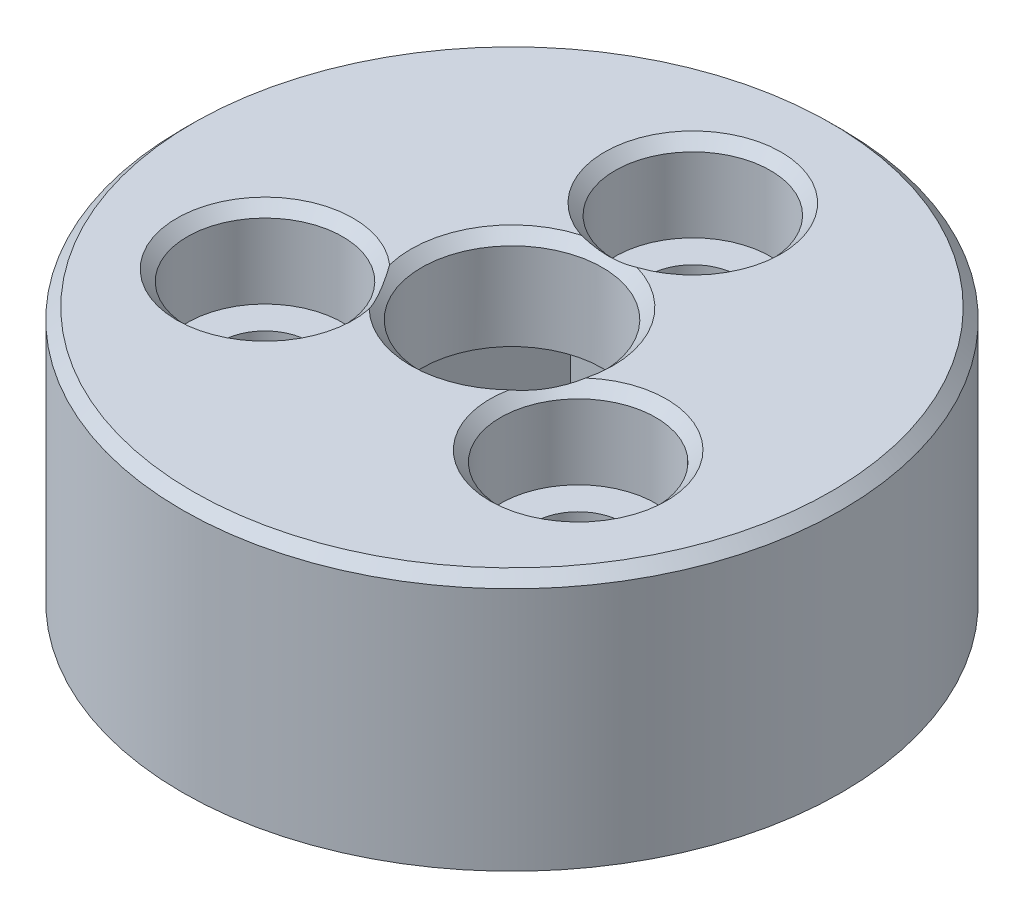
ISO-10303-21;
HEADER;
FILE_DESCRIPTION(('STEP AP214'),'2;1');
FILE_NAME('part.step','',(''),(''),'','','');
FILE_SCHEMA(('AUTOMOTIVE_DESIGN { 1 0 10303 214 1 1 1 1 }'));
ENDSEC;
DATA;
#1=APPLICATION_CONTEXT('core data for automotive mechanical design processes');
#2=APPLICATION_PROTOCOL_DEFINITION('international standard','automotive_design',2000,#1);
#3=PRODUCT_CONTEXT('',#1,'mechanical');
#4=PRODUCT('Part','Part','',(#3));
#5=PRODUCT_RELATED_PRODUCT_CATEGORY('part','',(#4));
#6=PRODUCT_DEFINITION_FORMATION('','',#4);
#7=PRODUCT_DEFINITION_CONTEXT('part definition',#1,'design');
#8=PRODUCT_DEFINITION('design','',#6,#7);
#9=PRODUCT_DEFINITION_SHAPE('','',#8);
#10=(LENGTH_UNIT() NAMED_UNIT(*) SI_UNIT(.MILLI.,.METRE.));
#11=(NAMED_UNIT(*) PLANE_ANGLE_UNIT() SI_UNIT($,.RADIAN.));
#12=(NAMED_UNIT(*) SI_UNIT($,.STERADIAN.) SOLID_ANGLE_UNIT());
#13=UNCERTAINTY_MEASURE_WITH_UNIT(LENGTH_MEASURE(1.E-05),#10,'distance_accuracy_value','');
#14=(GEOMETRIC_REPRESENTATION_CONTEXT(3) GLOBAL_UNCERTAINTY_ASSIGNED_CONTEXT((#13)) GLOBAL_UNIT_ASSIGNED_CONTEXT((#10,
#11,#12)) REPRESENTATION_CONTEXT('',''));
#15=CARTESIAN_POINT('',(0.,0.,0.));
#16=DIRECTION('',(0.,0.,1.));
#17=DIRECTION('',(1.,0.,0.));
#18=AXIS2_PLACEMENT_3D('',#15,#16,#17);
#19=CARTESIAN_POINT('',(-7.36121593216715,0.,4.25000000000033));
#20=DIRECTION('',(0.,1.,0.));
#21=DIRECTION('',(0.,0.,1.));
#22=AXIS2_PLACEMENT_3D('',#19,#20,#21);
#23=CYLINDRICAL_SURFACE('',#22,2.1);
#24=CARTESIAN_POINT('',(-7.36121593216715,7.4,4.25000000000033));
#25=DIRECTION('',(0.,-1.,0.));
#26=DIRECTION('',(0.,0.,-1.));
#27=AXIS2_PLACEMENT_3D('',#24,#25,#26);
#28=CIRCLE('',#27,2.1);
#29=CARTESIAN_POINT('',(-5.43622822501933,7.4,5.08929871162199));
#30=VERTEX_POINT('',#29);
#31=CARTESIAN_POINT('',(-7.11454987921227,7.4,2.16453701583599));
#32=VERTEX_POINT('',#31);
#33=EDGE_CURVE('E257',#30,#32,#28,.F.);
#34=ORIENTED_EDGE('',*,*,#33,.F.);
#35=DIRECTION('',(0.,1.,0.));
#36=VECTOR('',#35,1.);
#37=CARTESIAN_POINT('',(-5.43622822501933,0.,5.08929871162199));
#38=LINE('',#37,#36);
#39=CARTESIAN_POINT('',(-5.43622822501933,0.,5.08929871162199));
#40=VERTEX_POINT('',#39);
#41=EDGE_CURVE('E395',#30,#40,#38,.F.);
#42=ORIENTED_EDGE('',*,*,#41,.T.);
#43=CARTESIAN_POINT('',(-7.36121593216715,0.,4.25000000000033));
#44=DIRECTION('',(0.,1.,0.));
#45=DIRECTION('',(0.,0.,1.));
#46=AXIS2_PLACEMENT_3D('',#43,#44,#45);
#47=CIRCLE('',#46,2.1);
#48=CARTESIAN_POINT('',(-7.11454987921227,0.,2.16453701583599));
#49=VERTEX_POINT('',#48);
#50=EDGE_CURVE('E261',#49,#40,#47,.T.);
#51=ORIENTED_EDGE('',*,*,#50,.F.);
#52=DIRECTION('',(0.,1.,0.));
#53=VECTOR('',#52,1.);
#54=CARTESIAN_POINT('',(-7.11454987921227,0.,2.16453701583599));
#55=LINE('',#54,#53);
#56=EDGE_CURVE('E392',#49,#32,#55,.T.);
#57=ORIENTED_EDGE('',*,*,#56,.T.);
#58=EDGE_LOOP('',(#34,#42,#51,#57));
#59=FACE_BOUND('',#58,.T.);
#60=CARTESIAN_POINT('',(-7.36121593216715,8.,4.25000000000033));
#61=DIRECTION('',(0.,1.,0.));
#62=DIRECTION('',(0.,0.,1.));
#63=AXIS2_PLACEMENT_3D('',#60,#61,#62);
#64=CIRCLE('',#63,2.1);
#65=CARTESIAN_POINT('',(-7.36121593216715,8.,6.35000000000033));
#66=VERTEX_POINT('',#65);
#67=EDGE_CURVE('E283',#66,#66,#64,.F.);
#68=ORIENTED_EDGE('',*,*,#67,.F.);
#69=EDGE_LOOP('',(#68));
#70=FACE_BOUND('',#69,.T.);
#71=ADVANCED_FACE('F36',(#59,#70),#23,.F.);
#72=CARTESIAN_POINT('',(7.3612159321683,0.,4.24999999999967));
#73=DIRECTION('',(0.,1.,0.));
#74=DIRECTION('',(0.,0.,1.));
#75=AXIS2_PLACEMENT_3D('',#72,#73,#74);
#76=CYLINDRICAL_SURFACE('',#75,2.1);
#77=CARTESIAN_POINT('',(7.3612159321683,7.4,4.24999999999967));
#78=DIRECTION('',(0.,-1.,0.));
#79=DIRECTION('',(0.,0.,-1.));
#80=AXIS2_PLACEMENT_3D('',#77,#78,#79);
#81=CIRCLE('',#80,2.1);
#82=CARTESIAN_POINT('',(7.12557608422164,7.4,2.16326238782614));
#83=VERTEX_POINT('',#82);
#84=CARTESIAN_POINT('',(5.43181898275217,7.4,5.07911242397106));
#85=VERTEX_POINT('',#84);
#86=EDGE_CURVE('E255',#83,#85,#81,.F.);
#87=ORIENTED_EDGE('',*,*,#86,.F.);
#88=DIRECTION('',(0.,1.,0.));
#89=VECTOR('',#88,1.);
#90=CARTESIAN_POINT('',(7.12557608422164,0.,2.16326238782614));
#91=LINE('',#90,#89);
#92=CARTESIAN_POINT('',(7.12557608422164,0.,2.16326238782614));
#93=VERTEX_POINT('',#92);
#94=EDGE_CURVE('E373',#83,#93,#91,.F.);
#95=ORIENTED_EDGE('',*,*,#94,.T.);
#96=CARTESIAN_POINT('',(7.3612159321683,0.,4.24999999999967));
#97=DIRECTION('',(0.,1.,0.));
#98=DIRECTION('',(0.,0.,1.));
#99=AXIS2_PLACEMENT_3D('',#96,#97,#98);
#100=CIRCLE('',#99,2.1);
#101=CARTESIAN_POINT('',(5.43181898275217,0.,5.07911242397106));
#102=VERTEX_POINT('',#101);
#103=EDGE_CURVE('E262',#102,#93,#100,.T.);
#104=ORIENTED_EDGE('',*,*,#103,.F.);
#105=DIRECTION('',(0.,1.,0.));
#106=VECTOR('',#105,1.);
#107=CARTESIAN_POINT('',(5.43181898275217,0.,5.07911242397106));
#108=LINE('',#107,#106);
#109=EDGE_CURVE('E323',#102,#85,#108,.T.);
#110=ORIENTED_EDGE('',*,*,#109,.T.);
#111=EDGE_LOOP('',(#87,#95,#104,#110));
#112=FACE_BOUND('',#111,.T.);
#113=CARTESIAN_POINT('',(7.3612159321683,8.,4.24999999999967));
#114=DIRECTION('',(0.,1.,0.));
#115=DIRECTION('',(0.,0.,1.));
#116=AXIS2_PLACEMENT_3D('',#113,#114,#115);
#117=CIRCLE('',#116,2.1);
#118=CARTESIAN_POINT('',(7.3612159321683,8.,6.34999999999967));
#119=VERTEX_POINT('',#118);
#120=EDGE_CURVE('E280',#119,#119,#117,.F.);
#121=ORIENTED_EDGE('',*,*,#120,.F.);
#122=EDGE_LOOP('',(#121));
#123=FACE_BOUND('',#122,.T.);
#124=ADVANCED_FACE('F463',(#112,#123),#76,.F.);
#125=CARTESIAN_POINT('',(0.,0.,-8.5));
#126=DIRECTION('',(0.,1.,0.));
#127=DIRECTION('',(0.,0.,1.));
#128=AXIS2_PLACEMENT_3D('',#125,#126,#127);
#129=CYLINDRICAL_SURFACE('',#128,2.1);
#130=CARTESIAN_POINT('',(0.,0.,-8.5));
#131=DIRECTION('',(0.,1.,0.));
#132=DIRECTION('',(0.,0.,1.));
#133=AXIS2_PLACEMENT_3D('',#130,#131,#132);
#134=CIRCLE('',#133,2.1);
#135=CARTESIAN_POINT('',(1.68273089646079,0.,-7.24364943980739));
#136=VERTEX_POINT('',#135);
#137=CARTESIAN_POINT('',(-1.68934785920162,0.,-7.25256109944779));
#138=VERTEX_POINT('',#137);
#139=EDGE_CURVE('E265',#136,#138,#134,.T.);
#140=ORIENTED_EDGE('',*,*,#139,.F.);
#141=DIRECTION('',(0.,1.,0.));
#142=VECTOR('',#141,1.);
#143=CARTESIAN_POINT('',(1.68273089646079,0.,-7.24364943980739));
#144=LINE('',#143,#142);
#145=CARTESIAN_POINT('',(1.68273089646079,7.4,-7.24364943980739));
#146=VERTEX_POINT('',#145);
#147=EDGE_CURVE('E405',#136,#146,#144,.T.);
#148=ORIENTED_EDGE('',*,*,#147,.T.);
#149=CARTESIAN_POINT('',(0.,7.4,-8.5));
#150=DIRECTION('',(0.,-1.,0.));
#151=DIRECTION('',(0.,0.,-1.));
#152=AXIS2_PLACEMENT_3D('',#149,#150,#151);
#153=CIRCLE('',#152,2.1);
#154=CARTESIAN_POINT('',(-1.68934785920162,7.4,-7.25256109944779));
#155=VERTEX_POINT('',#154);
#156=EDGE_CURVE('E259',#155,#146,#153,.F.);
#157=ORIENTED_EDGE('',*,*,#156,.F.);
#158=DIRECTION('',(0.,1.,0.));
#159=VECTOR('',#158,1.);
#160=CARTESIAN_POINT('',(-1.68934785920162,0.,-7.25256109944779));
#161=LINE('',#160,#159);
#162=EDGE_CURVE('E402',#155,#138,#161,.F.);
#163=ORIENTED_EDGE('',*,*,#162,.T.);
#164=EDGE_LOOP('',(#140,#148,#157,#163));
#165=FACE_BOUND('',#164,.T.);
#166=CARTESIAN_POINT('',(0.,8.,-8.5));
#167=DIRECTION('',(0.,1.,0.));
#168=DIRECTION('',(0.,0.,1.));
#169=AXIS2_PLACEMENT_3D('',#166,#167,#168);
#170=CIRCLE('',#169,2.1);
#171=CARTESIAN_POINT('',(0.,8.,-6.4));
#172=VERTEX_POINT('',#171);
#173=EDGE_CURVE('E276',#172,#172,#170,.F.);
#174=ORIENTED_EDGE('',*,*,#173,.F.);
#175=EDGE_LOOP('',(#174));
#176=FACE_BOUND('',#175,.T.);
#177=ADVANCED_FACE('F491',(#165,#176),#129,.F.);
#178=CARTESIAN_POINT('',(0.,0.,0.));
#179=DIRECTION('',(0.,1.,0.));
#180=DIRECTION('',(0.,0.,1.));
#181=AXIS2_PLACEMENT_3D('',#178,#179,#180);
#182=CYLINDRICAL_SURFACE('',#181,4.25);
#183=CARTESIAN_POINT('',(0.,11.5,0.));
#184=DIRECTION('',(0.,1.,0.));
#185=DIRECTION('',(0.,0.,1.));
#186=AXIS2_PLACEMENT_3D('',#183,#184,#185);
#187=CIRCLE('',#186,4.25);
#188=CARTESIAN_POINT('',(0.,11.5,4.25));
#189=VERTEX_POINT('',#188);
#190=EDGE_CURVE('E314',#189,#189,#187,.T.);
#191=ORIENTED_EDGE('',*,*,#190,.T.);
#192=EDGE_LOOP('',(#191));
#193=FACE_BOUND('',#192,.T.);
#194=CARTESIAN_POINT('',(0.,7.4,0.));
#195=DIRECTION('',(0.,-1.,0.));
#196=DIRECTION('',(0.,0.,-1.));
#197=AXIS2_PLACEMENT_3D('',#194,#195,#196);
#198=CIRCLE('',#197,4.25);
#199=CARTESIAN_POINT('',(0.,7.4,-4.25));
#200=VERTEX_POINT('',#199);
#201=EDGE_CURVE('E245',#200,#200,#198,.F.);
#202=ORIENTED_EDGE('',*,*,#201,.F.);
#203=EDGE_LOOP('',(#202));
#204=FACE_BOUND('',#203,.T.);
#205=ADVANCED_FACE('F497',(#193,#204),#182,.F.);
#206=CARTESIAN_POINT('',(0.,12.,0.));
#207=DIRECTION('',(0.,-1.,0.));
#208=DIRECTION('',(0.,0.,-1.));
#209=AXIS2_PLACEMENT_3D('',#206,#207,#208);
#210=CYLINDRICAL_SURFACE('',#209,15.5);
#211=CARTESIAN_POINT('',(0.,11.5,0.));
#212=DIRECTION('',(0.,1.,0.));
#213=DIRECTION('',(0.,0.,1.));
#214=AXIS2_PLACEMENT_3D('',#211,#212,#213);
#215=CIRCLE('',#214,15.5);
#216=CARTESIAN_POINT('',(0.,11.5,15.5));
#217=VERTEX_POINT('',#216);
#218=EDGE_CURVE('E320',#217,#217,#215,.F.);
#219=ORIENTED_EDGE('',*,*,#218,.T.);
#220=EDGE_LOOP('',(#219));
#221=FACE_BOUND('',#220,.T.);
#222=CARTESIAN_POINT('',(0.,0.,0.));
#223=DIRECTION('',(0.,1.,0.));
#224=DIRECTION('',(0.,0.,1.));
#225=AXIS2_PLACEMENT_3D('',#222,#223,#224);
#226=CIRCLE('',#225,15.5);
#227=CARTESIAN_POINT('',(0.,0.,15.5));
#228=VERTEX_POINT('',#227);
#229=EDGE_CURVE('E270',#228,#228,#226,.T.);
#230=ORIENTED_EDGE('',*,*,#229,.T.);
#231=EDGE_LOOP('',(#230));
#232=FACE_BOUND('',#231,.T.);
#233=ADVANCED_FACE('F502',(#221,#232),#210,.T.);
#234=CARTESIAN_POINT('',(0.,12.,0.));
#235=DIRECTION('',(0.,1.,0.));
#236=DIRECTION('',(0.,0.,1.));
#237=AXIS2_PLACEMENT_3D('',#234,#235,#236);
#238=PLANE('',#237);
#239=CARTESIAN_POINT('',(7.3612159321683,12.,4.24999999999967));
#240=DIRECTION('',(0.,1.,0.));
#241=DIRECTION('',(0.,0.,1.));
#242=AXIS2_PLACEMENT_3D('',#239,#240,#241);
#243=CIRCLE('',#242,4.15000000000001);
#244=CARTESIAN_POINT('',(4.61054191633622,12.,1.14254244459746));
#245=VERTEX_POINT('',#244);
#246=CARTESIAN_POINT('',(7.3612159321683,12.,8.39999999999968));
#247=VERTEX_POINT('',#246);
#248=EDGE_CURVE('E298',#245,#247,#243,.F.);
#249=ORIENTED_EDGE('',*,*,#248,.T.);
#250=CARTESIAN_POINT('',(7.3612159321683,12.,4.24999999999967));
#251=DIRECTION('',(0.,1.,0.));
#252=DIRECTION('',(0.,0.,1.));
#253=AXIS2_PLACEMENT_3D('',#250,#251,#252);
#254=CIRCLE('',#253,4.15000000000001);
#255=CARTESIAN_POINT('',(3.29474174009195,12.,3.42157520246098));
#256=VERTEX_POINT('',#255);
#257=EDGE_CURVE('E309',#247,#256,#254,.F.);
#258=ORIENTED_EDGE('',*,*,#257,.T.);
#259=CARTESIAN_POINT('',(0.,12.,0.));
#260=DIRECTION('',(0.,1.,0.));
#261=DIRECTION('',(0.,0.,1.));
#262=AXIS2_PLACEMENT_3D('',#259,#260,#261);
#263=CIRCLE('',#262,4.75);
#264=CARTESIAN_POINT('',(0.,12.,4.75));
#265=VERTEX_POINT('',#264);
#266=EDGE_CURVE('E307',#256,#265,#263,.F.);
#267=ORIENTED_EDGE('',*,*,#266,.T.);
#268=CARTESIAN_POINT('',(0.,12.,0.));
#269=DIRECTION('',(0.,1.,0.));
#270=DIRECTION('',(0.,0.,1.));
#271=AXIS2_PLACEMENT_3D('',#268,#269,#270);
#272=CIRCLE('',#271,4.75);
#273=CARTESIAN_POINT('',(-3.29474174009069,12.,3.4215752024622));
#274=VERTEX_POINT('',#273);
#275=EDGE_CURVE('E305',#265,#274,#272,.F.);
#276=ORIENTED_EDGE('',*,*,#275,.T.);
#277=CARTESIAN_POINT('',(-7.36121593216715,12.,4.25000000000033));
#278=DIRECTION('',(0.,1.,0.));
#279=DIRECTION('',(0.,0.,1.));
#280=AXIS2_PLACEMENT_3D('',#277,#278,#279);
#281=CIRCLE('',#280,4.15000000000001);
#282=CARTESIAN_POINT('',(-7.36121593216715,12.,8.40000000000034));
#283=VERTEX_POINT('',#282);
#284=EDGE_CURVE('E302',#274,#283,#281,.F.);
#285=ORIENTED_EDGE('',*,*,#284,.T.);
#286=CARTESIAN_POINT('',(-7.36121593216715,12.,4.25000000000033));
#287=DIRECTION('',(0.,1.,0.));
#288=DIRECTION('',(0.,0.,1.));
#289=AXIS2_PLACEMENT_3D('',#286,#287,#288);
#290=CIRCLE('',#289,4.15000000000001);
#291=CARTESIAN_POINT('',(-4.61054191633633,12.,1.14254244459701));
#292=VERTEX_POINT('',#291);
#293=EDGE_CURVE('E300',#283,#292,#290,.F.);
#294=ORIENTED_EDGE('',*,*,#293,.T.);
#295=CARTESIAN_POINT('',(0.,12.,0.));
#296=DIRECTION('',(0.,1.,0.));
#297=DIRECTION('',(0.,0.,1.));
#298=AXIS2_PLACEMENT_3D('',#295,#296,#297);
#299=CIRCLE('',#298,4.75);
#300=CARTESIAN_POINT('',(-1.31580017624496,12.,-4.56411764705882));
#301=VERTEX_POINT('',#300);
#302=EDGE_CURVE('E294',#292,#301,#299,.F.);
#303=ORIENTED_EDGE('',*,*,#302,.T.);
#304=CARTESIAN_POINT('',(0.,12.,-8.5));
#305=DIRECTION('',(0.,1.,0.));
#306=DIRECTION('',(0.,0.,1.));
#307=AXIS2_PLACEMENT_3D('',#304,#305,#306);
#308=CIRCLE('',#307,4.15000000000001);
#309=CARTESIAN_POINT('',(1.31580017624496,12.,-4.56411764705882));
#310=VERTEX_POINT('',#309);
#311=EDGE_CURVE('E292',#301,#310,#308,.F.);
#312=ORIENTED_EDGE('',*,*,#311,.T.);
#313=CARTESIAN_POINT('',(0.,12.,0.));
#314=DIRECTION('',(0.,1.,0.));
#315=DIRECTION('',(0.,0.,1.));
#316=AXIS2_PLACEMENT_3D('',#313,#314,#315);
#317=CIRCLE('',#316,4.75);
#318=EDGE_CURVE('E296',#310,#245,#317,.F.);
#319=ORIENTED_EDGE('',*,*,#318,.T.);
#320=EDGE_LOOP('',(#249,#258,#267,#276,#285,#294,#303,#312,#319));
#321=FACE_BOUND('',#320,.T.);
#322=CARTESIAN_POINT('',(0.,12.,0.));
#323=DIRECTION('',(0.,1.,0.));
#324=DIRECTION('',(0.,0.,1.));
#325=AXIS2_PLACEMENT_3D('',#322,#323,#324);
#326=CIRCLE('',#325,15.);
#327=CARTESIAN_POINT('',(0.,12.,15.));
#328=VERTEX_POINT('',#327);
#329=EDGE_CURVE('E289',#328,#328,#326,.T.);
#330=ORIENTED_EDGE('',*,*,#329,.T.);
#331=EDGE_LOOP('',(#330));
#332=FACE_BOUND('',#331,.T.);
#333=ADVANCED_FACE('F499',(#321,#332),#238,.T.);
#334=CARTESIAN_POINT('',(0.,0.,0.));
#335=DIRECTION('',(0.,1.,0.));
#336=DIRECTION('',(0.,0.,1.));
#337=AXIS2_PLACEMENT_3D('',#334,#335,#336);
#338=PLANE('',#337);
#339=ORIENTED_EDGE('',*,*,#103,.T.);
#340=CARTESIAN_POINT('',(7.06947135852005,0.,1.6664200992134));
#341=DIRECTION('',(0.,1.,0.));
#342=DIRECTION('',(0.,0.,1.));
#343=AXIS2_PLACEMENT_3D('',#340,#341,#342);
#344=CIRCLE('',#343,0.5);
#345=CARTESIAN_POINT('',(6.63712086125736,0.,1.41527661927274));
#346=VERTEX_POINT('',#345);
#347=EDGE_CURVE('E386',#93,#346,#344,.F.);
#348=ORIENTED_EDGE('',*,*,#347,.T.);
#349=DIRECTION('',(-0.502286959881321,0.,0.864700994525379));
#350=VECTOR('',#349,1.);
#351=CARTESIAN_POINT('',(7.44779246385028,0.,0.019682871106941));
#352=LINE('',#351,#350);
#353=CARTESIAN_POINT('',(7.44779246385028,0.,0.019682871106941));
#354=VERTEX_POINT('',#353);
#355=EDGE_CURVE('E231',#354,#346,#352,.T.);
#356=ORIENTED_EDGE('',*,*,#355,.F.);
#357=DIRECTION('',(0.497709547995986,0.,0.867343764509569));
#358=VECTOR('',#357,1.);
#359=CARTESIAN_POINT('',(3.74094209832316,0.,-6.44013604025517));
#360=LINE('',#359,#358);
#361=CARTESIAN_POINT('',(3.74094209832316,0.,-6.44013604025517));
#362=VERTEX_POINT('',#361);
#363=EDGE_CURVE('E228',#362,#354,#360,.T.);
#364=ORIENTED_EDGE('',*,*,#363,.F.);
#365=DIRECTION('',(0.999996507877308,0.,0.00264276998419002));
#366=VECTOR('',#365,1.);
#367=CARTESIAN_POINT('',(-3.70685036552711,0.,-6.45981891136211));
#368=LINE('',#367,#366);
#369=CARTESIAN_POINT('',(2.08205972491174,0.,-6.4445201001086));
#370=VERTEX_POINT('',#369);
#371=EDGE_CURVE('E202',#370,#362,#368,.T.);
#372=ORIENTED_EDGE('',*,*,#371,.F.);
#373=CARTESIAN_POINT('',(2.08338110990383,0.,-6.94451835404725));
#374=DIRECTION('',(0.,1.,0.));
#375=DIRECTION('',(0.,0.,1.));
#376=AXIS2_PLACEMENT_3D('',#373,#374,#375);
#377=CIRCLE('',#376,0.5);
#378=EDGE_CURVE('E378',#370,#136,#377,.F.);
#379=ORIENTED_EDGE('',*,*,#378,.T.);
#380=ORIENTED_EDGE('',*,*,#139,.T.);
#381=CARTESIAN_POINT('',(-2.09157353996391,0.,-6.95555183741155));
#382=DIRECTION('',(0.,1.,0.));
#383=DIRECTION('',(0.,0.,1.));
#384=AXIS2_PLACEMENT_3D('',#381,#382,#383);
#385=CIRCLE('',#384,0.5);
#386=CARTESIAN_POINT('',(-2.09289492495601,0.,-6.4555535834729));
#387=VERTEX_POINT('',#386);
#388=EDGE_CURVE('E376',#138,#387,#385,.F.);
#389=ORIENTED_EDGE('',*,*,#388,.T.);
#390=CARTESIAN_POINT('',(-3.70685036552711,0.,-6.45981891136211));
#391=VERTEX_POINT('',#390);
#392=EDGE_CURVE('E226',#391,#387,#368,.T.);
#393=ORIENTED_EDGE('',*,*,#392,.F.);
#394=DIRECTION('',(0.502286959881321,0.,-0.864700994525379));
#395=VECTOR('',#394,1.);
#396=CARTESIAN_POINT('',(-7.44779246385028,0.,-0.019682871106941));
#397=LINE('',#396,#395);
#398=CARTESIAN_POINT('',(-7.44779246385028,0.,-0.019682871106941));
#399=VERTEX_POINT('',#398);
#400=EDGE_CURVE('E196',#399,#391,#397,.T.);
#401=ORIENTED_EDGE('',*,*,#400,.F.);
#402=DIRECTION('',(-0.497709547995986,0.,-0.867343764509569));
#403=VECTOR('',#402,1.);
#404=CARTESIAN_POINT('',(-3.74094209832316,0.,6.44013604025517));
#405=LINE('',#404,#403);
#406=CARTESIAN_POINT('',(-6.62214798434918,0.,1.41914343608458));
#407=VERTEX_POINT('',#406);
#408=EDGE_CURVE('E237',#407,#399,#405,.T.);
#409=ORIENTED_EDGE('',*,*,#408,.F.);
#410=CARTESIAN_POINT('',(-7.05581986660396,0.,1.66799821008257));
#411=DIRECTION('',(0.,1.,0.));
#412=DIRECTION('',(0.,0.,1.));
#413=AXIS2_PLACEMENT_3D('',#410,#411,#412);
#414=CIRCLE('',#413,0.5);
#415=EDGE_CURVE('E380',#407,#49,#414,.F.);
#416=ORIENTED_EDGE('',*,*,#415,.T.);
#417=ORIENTED_EDGE('',*,*,#50,.T.);
#418=CARTESIAN_POINT('',(-4.97789781855557,0.,5.28913173819858));
#419=DIRECTION('',(0.,1.,0.));
#420=DIRECTION('',(0.,0.,1.));
#421=AXIS2_PLACEMENT_3D('',#418,#419,#420);
#422=CIRCLE('',#421,0.5);
#423=CARTESIAN_POINT('',(-4.54422593630078,0.,5.04027696420059));
#424=VERTEX_POINT('',#423);
#425=EDGE_CURVE('E382',#40,#424,#422,.F.);
#426=ORIENTED_EDGE('',*,*,#425,.T.);
#427=CARTESIAN_POINT('',(-3.74094209832316,0.,6.44013604025517));
#428=VERTEX_POINT('',#427);
#429=EDGE_CURVE('E238',#428,#424,#405,.T.);
#430=ORIENTED_EDGE('',*,*,#429,.F.);
#431=DIRECTION('',(-0.999996507877308,0.,-0.0026427699841899));
#432=VECTOR('',#431,1.);
#433=CARTESIAN_POINT('',(3.70685036552711,0.,6.45981891136211));
#434=LINE('',#433,#432);
#435=CARTESIAN_POINT('',(3.70685036552711,0.,6.45981891136211));
#436=VERTEX_POINT('',#435);
#437=EDGE_CURVE('E234',#436,#428,#434,.T.);
#438=ORIENTED_EDGE('',*,*,#437,.F.);
#439=CARTESIAN_POINT('',(4.54008825943802,0.,5.02537666402359));
#440=VERTEX_POINT('',#439);
#441=EDGE_CURVE('E230',#440,#436,#352,.T.);
#442=ORIENTED_EDGE('',*,*,#441,.F.);
#443=CARTESIAN_POINT('',(4.97243875670071,0.,5.27652014396425));
#444=DIRECTION('',(0.,1.,0.));
#445=DIRECTION('',(0.,0.,1.));
#446=AXIS2_PLACEMENT_3D('',#443,#444,#445);
#447=CIRCLE('',#446,0.5);
#448=EDGE_CURVE('E384',#440,#102,#447,.F.);
#449=ORIENTED_EDGE('',*,*,#448,.T.);
#450=EDGE_LOOP('',(#339,#348,#356,#364,#372,#379,#380,#389,#393,#401,#409,#416,#417,#426,#430,
#438,#442,#449));
#451=FACE_BOUND('',#450,.T.);
#452=ORIENTED_EDGE('',*,*,#229,.F.);
#453=EDGE_LOOP('',(#452));
#454=FACE_BOUND('',#453,.T.);
#455=ADVANCED_FACE('F434',(#451,#454),#338,.F.);
#456=CARTESIAN_POINT('',(-3.70685036552711,7.4,-6.45981891136211));
#457=DIRECTION('',(0.00264276998419002,0.,-0.999996507877308));
#458=DIRECTION('',(-0.999996507877308,0.,-0.00264276998419002));
#459=AXIS2_PLACEMENT_3D('',#456,#457,#458);
#460=PLANE('',#459);
#461=ORIENTED_EDGE('',*,*,#392,.T.);
#462=DIRECTION('',(0.,1.,0.));
#463=VECTOR('',#462,1.);
#464=CARTESIAN_POINT('',(-2.09289492495601,7.4,-6.4555535834729));
#465=LINE('',#464,#463);
#466=CARTESIAN_POINT('',(-2.09289492495601,7.4,-6.4555535834729));
#467=VERTEX_POINT('',#466);
#468=EDGE_CURVE('E51',#387,#467,#465,.T.);
#469=ORIENTED_EDGE('',*,*,#468,.T.);
#470=DIRECTION('',(0.999996507877308,0.,0.00264276998419002));
#471=VECTOR('',#470,1.);
#472=CARTESIAN_POINT('',(-3.70685036552711,7.4,-6.45981891136211));
#473=LINE('',#472,#471);
#474=CARTESIAN_POINT('',(-3.70685036552711,7.4,-6.45981891136211));
#475=VERTEX_POINT('',#474);
#476=EDGE_CURVE('E195',#475,#467,#473,.T.);
#477=ORIENTED_EDGE('',*,*,#476,.F.);
#478=DIRECTION('',(0.,-1.,0.));
#479=VECTOR('',#478,1.);
#480=CARTESIAN_POINT('',(-3.70685036552711,7.4,-6.45981891136211));
#481=LINE('',#480,#479);
#482=EDGE_CURVE('E243',#475,#391,#481,.T.);
#483=ORIENTED_EDGE('',*,*,#482,.T.);
#484=EDGE_LOOP('',(#461,#469,#477,#483));
#485=FACE_BOUND('',#484,.T.);
#486=ADVANCED_FACE('F505',(#485),#460,.F.);
#487=CARTESIAN_POINT('',(2.08205972491174,7.4,-6.4445201001086));
#488=VERTEX_POINT('',#487);
#489=CARTESIAN_POINT('',(3.74094209832316,7.4,-6.44013604025517));
#490=VERTEX_POINT('',#489);
#491=EDGE_CURVE('E187',#488,#490,#473,.T.);
#492=ORIENTED_EDGE('',*,*,#491,.F.);
#493=DIRECTION('',(0.,1.,0.));
#494=VECTOR('',#493,1.);
#495=CARTESIAN_POINT('',(2.08205972491174,7.4,-6.4445201001086));
#496=LINE('',#495,#494);
#497=EDGE_CURVE('E408',#488,#370,#496,.F.);
#498=ORIENTED_EDGE('',*,*,#497,.T.);
#499=ORIENTED_EDGE('',*,*,#371,.T.);
#500=DIRECTION('',(0.,-1.,0.));
#501=VECTOR('',#500,1.);
#502=CARTESIAN_POINT('',(3.74094209832316,7.4,-6.44013604025517));
#503=LINE('',#502,#501);
#504=EDGE_CURVE('E199',#490,#362,#503,.T.);
#505=ORIENTED_EDGE('',*,*,#504,.F.);
#506=EDGE_LOOP('',(#492,#498,#499,#505));
#507=FACE_BOUND('',#506,.T.);
#508=ADVANCED_FACE('F200',(#507),#460,.F.);
#509=CARTESIAN_POINT('',(-3.74094209832316,7.4,6.44013604025517));
#510=DIRECTION('',(-0.867343764509569,0.,0.497709547995986));
#511=DIRECTION('',(0.497709547995986,0.,0.867343764509569));
#512=AXIS2_PLACEMENT_3D('',#509,#510,#511);
#513=PLANE('',#512);
#514=ORIENTED_EDGE('',*,*,#429,.T.);
#515=DIRECTION('',(0.,1.,0.));
#516=VECTOR('',#515,1.);
#517=CARTESIAN_POINT('',(-4.54422593630078,7.4,5.04027696420059));
#518=LINE('',#517,#516);
#519=CARTESIAN_POINT('',(-4.54422593630078,7.4,5.04027696420059));
#520=VERTEX_POINT('',#519);
#521=EDGE_CURVE('E398',#424,#520,#518,.T.);
#522=ORIENTED_EDGE('',*,*,#521,.T.);
#523=DIRECTION('',(-0.497709547995986,0.,-0.867343764509569));
#524=VECTOR('',#523,1.);
#525=CARTESIAN_POINT('',(-3.74094209832316,7.4,6.44013604025517));
#526=LINE('',#525,#524);
#527=CARTESIAN_POINT('',(-3.74094209832316,7.4,6.44013604025517));
#528=VERTEX_POINT('',#527);
#529=EDGE_CURVE('E221',#528,#520,#526,.T.);
#530=ORIENTED_EDGE('',*,*,#529,.F.);
#531=DIRECTION('',(0.,-1.,0.));
#532=VECTOR('',#531,1.);
#533=CARTESIAN_POINT('',(-3.74094209832316,7.4,6.44013604025517));
#534=LINE('',#533,#532);
#535=EDGE_CURVE('E249',#528,#428,#534,.T.);
#536=ORIENTED_EDGE('',*,*,#535,.T.);
#537=EDGE_LOOP('',(#514,#522,#530,#536));
#538=FACE_BOUND('',#537,.T.);
#539=ADVANCED_FACE('F447',(#538),#513,.F.);
#540=CARTESIAN_POINT('',(-6.62214798434918,7.4,1.41914343608458));
#541=VERTEX_POINT('',#540);
#542=CARTESIAN_POINT('',(-7.44779246385028,7.4,-0.019682871106941));
#543=VERTEX_POINT('',#542);
#544=EDGE_CURVE('E220',#541,#543,#526,.T.);
#545=ORIENTED_EDGE('',*,*,#544,.F.);
#546=DIRECTION('',(0.,1.,0.));
#547=VECTOR('',#546,1.);
#548=CARTESIAN_POINT('',(-6.62214798434918,7.4,1.41914343608458));
#549=LINE('',#548,#547);
#550=EDGE_CURVE('E400',#541,#407,#549,.F.);
#551=ORIENTED_EDGE('',*,*,#550,.T.);
#552=ORIENTED_EDGE('',*,*,#408,.T.);
#553=DIRECTION('',(0.,-1.,0.));
#554=VECTOR('',#553,1.);
#555=CARTESIAN_POINT('',(-7.44779246385028,7.4,-0.019682871106941));
#556=LINE('',#555,#554);
#557=EDGE_CURVE('E246',#543,#399,#556,.T.);
#558=ORIENTED_EDGE('',*,*,#557,.F.);
#559=EDGE_LOOP('',(#545,#551,#552,#558));
#560=FACE_BOUND('',#559,.T.);
#561=ADVANCED_FACE('F427',(#560),#513,.F.);
#562=CARTESIAN_POINT('',(7.44779246385028,7.4,0.019682871106941));
#563=DIRECTION('',(0.864700994525379,0.,0.502286959881321));
#564=DIRECTION('',(0.502286959881321,0.,-0.864700994525379));
#565=AXIS2_PLACEMENT_3D('',#562,#563,#564);
#566=PLANE('',#565);
#567=ORIENTED_EDGE('',*,*,#355,.T.);
#568=DIRECTION('',(0.,1.,0.));
#569=VECTOR('',#568,1.);
#570=CARTESIAN_POINT('',(6.63712086125736,7.4,1.41527661927274));
#571=LINE('',#570,#569);
#572=CARTESIAN_POINT('',(6.63712086125736,7.4,1.41527661927274));
#573=VERTEX_POINT('',#572);
#574=EDGE_CURVE('E388',#346,#573,#571,.T.);
#575=ORIENTED_EDGE('',*,*,#574,.T.);
#576=DIRECTION('',(-0.502286959881321,0.,0.864700994525379));
#577=VECTOR('',#576,1.);
#578=CARTESIAN_POINT('',(7.44779246385028,7.4,0.019682871106941));
#579=LINE('',#578,#577);
#580=CARTESIAN_POINT('',(7.44779246385028,7.4,0.019682871106941));
#581=VERTEX_POINT('',#580);
#582=EDGE_CURVE('E213',#581,#573,#579,.T.);
#583=ORIENTED_EDGE('',*,*,#582,.F.);
#584=DIRECTION('',(0.,-1.,0.));
#585=VECTOR('',#584,1.);
#586=CARTESIAN_POINT('',(7.44779246385028,7.4,0.019682871106941));
#587=LINE('',#586,#585);
#588=EDGE_CURVE('E206',#581,#354,#587,.T.);
#589=ORIENTED_EDGE('',*,*,#588,.T.);
#590=EDGE_LOOP('',(#567,#575,#583,#589));
#591=FACE_BOUND('',#590,.T.);
#592=ADVANCED_FACE('F470',(#591),#566,.F.);
#593=CARTESIAN_POINT('',(4.54008825943802,7.4,5.02537666402359));
#594=VERTEX_POINT('',#593);
#595=CARTESIAN_POINT('',(3.70685036552711,7.4,6.45981891136211));
#596=VERTEX_POINT('',#595);
#597=EDGE_CURVE('E211',#594,#596,#579,.T.);
#598=ORIENTED_EDGE('',*,*,#597,.F.);
#599=DIRECTION('',(0.,1.,0.));
#600=VECTOR('',#599,1.);
#601=CARTESIAN_POINT('',(4.54008825943802,7.4,5.02537666402359));
#602=LINE('',#601,#600);
#603=EDGE_CURVE('E390',#594,#440,#602,.F.);
#604=ORIENTED_EDGE('',*,*,#603,.T.);
#605=ORIENTED_EDGE('',*,*,#441,.T.);
#606=DIRECTION('',(0.,-1.,0.));
#607=VECTOR('',#606,1.);
#608=CARTESIAN_POINT('',(3.70685036552711,7.4,6.45981891136211));
#609=LINE('',#608,#607);
#610=EDGE_CURVE('E251',#596,#436,#609,.T.);
#611=ORIENTED_EDGE('',*,*,#610,.F.);
#612=EDGE_LOOP('',(#598,#604,#605,#611));
#613=FACE_BOUND('',#612,.T.);
#614=ADVANCED_FACE('F474',(#613),#566,.F.);
#615=CARTESIAN_POINT('',(0.,7.4,0.));
#616=DIRECTION('',(0.,-1.,0.));
#617=DIRECTION('',(0.,0.,-1.));
#618=AXIS2_PLACEMENT_3D('',#615,#616,#617);
#619=PLANE('',#618);
#620=ORIENTED_EDGE('',*,*,#201,.T.);
#621=EDGE_LOOP('',(#620));
#622=FACE_BOUND('',#621,.T.);
#623=ORIENTED_EDGE('',*,*,#156,.T.);
#624=CARTESIAN_POINT('',(2.08338110990383,7.4,-6.94451835404725));
#625=DIRECTION('',(0.,-1.,0.));
#626=DIRECTION('',(0.,0.,-1.));
#627=AXIS2_PLACEMENT_3D('',#624,#625,#626);
#628=CIRCLE('',#627,0.5);
#629=EDGE_CURVE('E44',#146,#488,#628,.F.);
#630=ORIENTED_EDGE('',*,*,#629,.T.);
#631=ORIENTED_EDGE('',*,*,#491,.T.);
#632=DIRECTION('',(0.497709547995986,0.,0.867343764509569));
#633=VECTOR('',#632,1.);
#634=CARTESIAN_POINT('',(3.74094209832316,7.4,-6.44013604025517));
#635=LINE('',#634,#633);
#636=EDGE_CURVE('E192',#490,#581,#635,.T.);
#637=ORIENTED_EDGE('',*,*,#636,.T.);
#638=ORIENTED_EDGE('',*,*,#582,.T.);
#639=CARTESIAN_POINT('',(7.06947135852005,7.4,1.6664200992134));
#640=DIRECTION('',(0.,-1.,0.));
#641=DIRECTION('',(0.,0.,-1.));
#642=AXIS2_PLACEMENT_3D('',#639,#640,#641);
#643=CIRCLE('',#642,0.5);
#644=EDGE_CURVE('E411',#573,#83,#643,.F.);
#645=ORIENTED_EDGE('',*,*,#644,.T.);
#646=ORIENTED_EDGE('',*,*,#86,.T.);
#647=CARTESIAN_POINT('',(4.97243875670071,7.4,5.27652014396425));
#648=DIRECTION('',(0.,-1.,0.));
#649=DIRECTION('',(0.,0.,-1.));
#650=AXIS2_PLACEMENT_3D('',#647,#648,#649);
#651=CIRCLE('',#650,0.5);
#652=EDGE_CURVE('E414',#85,#594,#651,.F.);
#653=ORIENTED_EDGE('',*,*,#652,.T.);
#654=ORIENTED_EDGE('',*,*,#597,.T.);
#655=DIRECTION('',(-0.999996507877308,0.,-0.0026427699841899));
#656=VECTOR('',#655,1.);
#657=CARTESIAN_POINT('',(3.70685036552711,7.4,6.45981891136211));
#658=LINE('',#657,#656);
#659=EDGE_CURVE('E217',#596,#528,#658,.T.);
#660=ORIENTED_EDGE('',*,*,#659,.T.);
#661=ORIENTED_EDGE('',*,*,#529,.T.);
#662=CARTESIAN_POINT('',(-4.97789781855557,7.4,5.28913173819858));
#663=DIRECTION('',(0.,-1.,0.));
#664=DIRECTION('',(0.,0.,-1.));
#665=AXIS2_PLACEMENT_3D('',#662,#663,#664);
#666=CIRCLE('',#665,0.5);
#667=EDGE_CURVE('E416',#520,#30,#666,.F.);
#668=ORIENTED_EDGE('',*,*,#667,.T.);
#669=ORIENTED_EDGE('',*,*,#33,.T.);
#670=CARTESIAN_POINT('',(-7.05581986660396,7.4,1.66799821008257));
#671=DIRECTION('',(0.,-1.,0.));
#672=DIRECTION('',(0.,0.,-1.));
#673=AXIS2_PLACEMENT_3D('',#670,#671,#672);
#674=CIRCLE('',#673,0.5);
#675=EDGE_CURVE('E419',#32,#541,#674,.F.);
#676=ORIENTED_EDGE('',*,*,#675,.T.);
#677=ORIENTED_EDGE('',*,*,#544,.T.);
#678=DIRECTION('',(0.502286959881321,0.,-0.864700994525379));
#679=VECTOR('',#678,1.);
#680=CARTESIAN_POINT('',(-7.44779246385028,7.4,-0.019682871106941));
#681=LINE('',#680,#679);
#682=EDGE_CURVE('E207',#543,#475,#681,.T.);
#683=ORIENTED_EDGE('',*,*,#682,.T.);
#684=ORIENTED_EDGE('',*,*,#476,.T.);
#685=CARTESIAN_POINT('',(-2.09157353996391,7.4,-6.95555183741155));
#686=DIRECTION('',(0.,-1.,0.));
#687=DIRECTION('',(0.,0.,-1.));
#688=AXIS2_PLACEMENT_3D('',#685,#686,#687);
#689=CIRCLE('',#688,0.5);
#690=EDGE_CURVE('E11',#467,#155,#689,.F.);
#691=ORIENTED_EDGE('',*,*,#690,.T.);
#692=EDGE_LOOP('',(#623,#630,#631,#637,#638,#645,#646,#653,#654,#660,#661,#668,#669,#676,#677,
#683,#684,#691));
#693=FACE_BOUND('',#692,.T.);
#694=ADVANCED_FACE('F189',(#622,#693),#619,.T.);
#695=CARTESIAN_POINT('',(-7.44779246385028,7.4,-0.019682871106941));
#696=DIRECTION('',(-0.864700994525379,0.,-0.502286959881321));
#697=DIRECTION('',(-0.502286959881321,0.,0.864700994525379));
#698=AXIS2_PLACEMENT_3D('',#695,#696,#697);
#699=PLANE('',#698);
#700=ORIENTED_EDGE('',*,*,#400,.T.);
#701=ORIENTED_EDGE('',*,*,#482,.F.);
#702=ORIENTED_EDGE('',*,*,#682,.F.);
#703=ORIENTED_EDGE('',*,*,#557,.T.);
#704=EDGE_LOOP('',(#700,#701,#702,#703));
#705=FACE_BOUND('',#704,.T.);
#706=ADVANCED_FACE('F481',(#705),#699,.F.);
#707=CARTESIAN_POINT('',(3.70685036552711,7.4,6.45981891136211));
#708=DIRECTION('',(-0.0026427699841899,0.,0.999996507877308));
#709=DIRECTION('',(0.999996507877308,0.,0.0026427699841899));
#710=AXIS2_PLACEMENT_3D('',#707,#708,#709);
#711=PLANE('',#710);
#712=ORIENTED_EDGE('',*,*,#437,.T.);
#713=ORIENTED_EDGE('',*,*,#535,.F.);
#714=ORIENTED_EDGE('',*,*,#659,.F.);
#715=ORIENTED_EDGE('',*,*,#610,.T.);
#716=EDGE_LOOP('',(#712,#713,#714,#715));
#717=FACE_BOUND('',#716,.T.);
#718=ADVANCED_FACE('F451',(#717),#711,.F.);
#719=CARTESIAN_POINT('',(3.74094209832316,7.4,-6.44013604025517));
#720=DIRECTION('',(0.867343764509569,0.,-0.497709547995986));
#721=DIRECTION('',(-0.497709547995986,0.,-0.867343764509569));
#722=AXIS2_PLACEMENT_3D('',#719,#720,#721);
#723=PLANE('',#722);
#724=ORIENTED_EDGE('',*,*,#363,.T.);
#725=ORIENTED_EDGE('',*,*,#588,.F.);
#726=ORIENTED_EDGE('',*,*,#636,.F.);
#727=ORIENTED_EDGE('',*,*,#504,.T.);
#728=EDGE_LOOP('',(#724,#725,#726,#727));
#729=FACE_BOUND('',#728,.T.);
#730=ADVANCED_FACE('F209',(#729),#723,.F.);
#731=CARTESIAN_POINT('',(0.,8.,-8.5));
#732=DIRECTION('',(0.,1.,0.));
#733=DIRECTION('',(0.,0.,1.));
#734=AXIS2_PLACEMENT_3D('',#731,#732,#733);
#735=PLANE('',#734);
#736=CARTESIAN_POINT('',(0.,8.,-8.5));
#737=DIRECTION('',(0.,1.,0.));
#738=DIRECTION('',(0.,0.,1.));
#739=AXIS2_PLACEMENT_3D('',#736,#737,#738);
#740=CIRCLE('',#739,3.65);
#741=CARTESIAN_POINT('',(0.,8.,-4.85));
#742=VERTEX_POINT('',#741);
#743=EDGE_CURVE('E279',#742,#742,#740,.T.);
#744=ORIENTED_EDGE('',*,*,#743,.T.);
#745=EDGE_LOOP('',(#744));
#746=FACE_BOUND('',#745,.T.);
#747=ORIENTED_EDGE('',*,*,#173,.T.);
#748=EDGE_LOOP('',(#747));
#749=FACE_BOUND('',#748,.T.);
#750=ADVANCED_FACE('F562',(#746,#749),#735,.T.);
#751=CARTESIAN_POINT('',(0.,8.,-8.5));
#752=DIRECTION('',(0.,1.,0.));
#753=DIRECTION('',(0.,0.,1.));
#754=AXIS2_PLACEMENT_3D('',#751,#752,#753);
#755=CYLINDRICAL_SURFACE('',#754,3.65);
#756=CARTESIAN_POINT('',(0.,11.5,-8.5));
#757=DIRECTION('',(0.,1.,0.));
#758=DIRECTION('',(0.,0.,1.));
#759=AXIS2_PLACEMENT_3D('',#756,#757,#758);
#760=CIRCLE('',#759,3.65);
#761=CARTESIAN_POINT('',(0.,11.5,-4.85));
#762=VERTEX_POINT('',#761);
#763=EDGE_CURVE('E317',#762,#762,#760,.T.);
#764=ORIENTED_EDGE('',*,*,#763,.T.);
#765=EDGE_LOOP('',(#764));
#766=FACE_BOUND('',#765,.T.);
#767=ORIENTED_EDGE('',*,*,#743,.F.);
#768=EDGE_LOOP('',(#767));
#769=FACE_BOUND('',#768,.T.);
#770=ADVANCED_FACE('F566',(#766,#769),#755,.F.);
#771=CARTESIAN_POINT('',(7.3612159321683,8.,4.24999999999967));
#772=DIRECTION('',(0.,1.,0.));
#773=DIRECTION('',(0.,0.,1.));
#774=AXIS2_PLACEMENT_3D('',#771,#772,#773);
#775=PLANE('',#774);
#776=CARTESIAN_POINT('',(7.3612159321683,8.,4.24999999999967));
#777=DIRECTION('',(0.,1.,0.));
#778=DIRECTION('',(0.,0.,1.));
#779=AXIS2_PLACEMENT_3D('',#776,#777,#778);
#780=CIRCLE('',#779,3.65);
#781=CARTESIAN_POINT('',(7.3612159321683,8.,7.89999999999967));
#782=VERTEX_POINT('',#781);
#783=EDGE_CURVE('E284',#782,#782,#780,.T.);
#784=ORIENTED_EDGE('',*,*,#783,.T.);
#785=EDGE_LOOP('',(#784));
#786=FACE_BOUND('',#785,.T.);
#787=ORIENTED_EDGE('',*,*,#120,.T.);
#788=EDGE_LOOP('',(#787));
#789=FACE_BOUND('',#788,.T.);
#790=ADVANCED_FACE('F572',(#786,#789),#775,.T.);
#791=CARTESIAN_POINT('',(7.3612159321683,8.,4.24999999999967));
#792=DIRECTION('',(0.,1.,0.));
#793=DIRECTION('',(0.,0.,1.));
#794=AXIS2_PLACEMENT_3D('',#791,#792,#793);
#795=CYLINDRICAL_SURFACE('',#794,3.65);
#796=CARTESIAN_POINT('',(7.3612159321683,11.5,4.24999999999967));
#797=DIRECTION('',(0.,1.,0.));
#798=DIRECTION('',(0.,0.,1.));
#799=AXIS2_PLACEMENT_3D('',#796,#797,#798);
#800=CIRCLE('',#799,3.65);
#801=CARTESIAN_POINT('',(7.3612159321683,11.5,7.89999999999967));
#802=VERTEX_POINT('',#801);
#803=EDGE_CURVE('E311',#802,#802,#800,.T.);
#804=ORIENTED_EDGE('',*,*,#803,.T.);
#805=EDGE_LOOP('',(#804));
#806=FACE_BOUND('',#805,.T.);
#807=ORIENTED_EDGE('',*,*,#783,.F.);
#808=EDGE_LOOP('',(#807));
#809=FACE_BOUND('',#808,.T.);
#810=ADVANCED_FACE('F584',(#806,#809),#795,.F.);
#811=CARTESIAN_POINT('',(-7.36121593216715,8.,4.25000000000033));
#812=DIRECTION('',(0.,1.,0.));
#813=DIRECTION('',(0.,0.,1.));
#814=AXIS2_PLACEMENT_3D('',#811,#812,#813);
#815=PLANE('',#814);
#816=CARTESIAN_POINT('',(-7.36121593216715,8.,4.25000000000033));
#817=DIRECTION('',(0.,1.,0.));
#818=DIRECTION('',(0.,0.,1.));
#819=AXIS2_PLACEMENT_3D('',#816,#817,#818);
#820=CIRCLE('',#819,3.65);
#821=CARTESIAN_POINT('',(-7.36121593216715,8.,7.90000000000033));
#822=VERTEX_POINT('',#821);
#823=EDGE_CURVE('E370',#822,#822,#820,.T.);
#824=ORIENTED_EDGE('',*,*,#823,.T.);
#825=EDGE_LOOP('',(#824));
#826=FACE_BOUND('',#825,.T.);
#827=ORIENTED_EDGE('',*,*,#67,.T.);
#828=EDGE_LOOP('',(#827));
#829=FACE_BOUND('',#828,.T.);
#830=ADVANCED_FACE('F580',(#826,#829),#815,.T.);
#831=CARTESIAN_POINT('',(-7.36121593216715,8.,4.25000000000033));
#832=DIRECTION('',(0.,1.,0.));
#833=DIRECTION('',(0.,0.,1.));
#834=AXIS2_PLACEMENT_3D('',#831,#832,#833);
#835=CYLINDRICAL_SURFACE('',#834,3.65);
#836=CARTESIAN_POINT('',(-7.36121593216715,11.5,4.25000000000033));
#837=DIRECTION('',(0.,1.,0.));
#838=DIRECTION('',(0.,0.,1.));
#839=AXIS2_PLACEMENT_3D('',#836,#837,#838);
#840=CIRCLE('',#839,3.65);
#841=CARTESIAN_POINT('',(-7.36121593216715,11.5,7.90000000000033));
#842=VERTEX_POINT('',#841);
#843=EDGE_CURVE('E273',#842,#842,#840,.T.);
#844=ORIENTED_EDGE('',*,*,#843,.T.);
#845=EDGE_LOOP('',(#844));
#846=FACE_BOUND('',#845,.T.);
#847=ORIENTED_EDGE('',*,*,#823,.F.);
#848=EDGE_LOOP('',(#847));
#849=FACE_BOUND('',#848,.T.);
#850=ADVANCED_FACE('F577',(#846,#849),#835,.F.);
#851=CARTESIAN_POINT('',(0.,11.5,-8.5));
#852=DIRECTION('',(0.,1.,0.));
#853=DIRECTION('',(0.,0.,1.));
#854=AXIS2_PLACEMENT_3D('',#851,#852,#853);
#855=CONICAL_SURFACE('',#854,3.65,0.785398163397449);
#856=ORIENTED_EDGE('',*,*,#763,.F.);
#857=EDGE_LOOP('',(#856));
#858=FACE_BOUND('',#857,.T.);
#859=CARTESIAN_POINT('',(1.31647304355343,12.0002,-4.56413176470588));
#860=CARTESIAN_POINT('',(1.25301187608412,11.9813324880132,-4.56279994033274));
#861=CARTESIAN_POINT('',(1.18921164936983,11.9636095399732,-4.56154890870572));
#862=CARTESIAN_POINT('',(1.06095868911122,11.9306284383902,-4.55922083094506));
#863=CARTESIAN_POINT('',(0.996505800921448,11.9153708842565,-4.55814382712265));
#864=CARTESIAN_POINT('',(0.802129903996669,11.873546414143,-4.55519151158924));
#865=CARTESIAN_POINT('',(0.671310562158445,11.8509642784462,-4.55359747849406));
#866=CARTESIAN_POINT('',(0.411589870246179,11.8180808296608,-4.55127629387566));
#867=CARTESIAN_POINT('',(0.282727375853269,11.8074748233603,-4.55052763459693));
#868=CARTESIAN_POINT('',(0.0246508626244903,11.7981088998209,-4.54986651057342));
#869=CARTESIAN_POINT('',(-0.104562793155335,11.7993395259816,-4.5499533783039));
#870=CARTESIAN_POINT('',(-0.324348559089374,11.8114457199407,-4.55080793317277));
#871=CARTESIAN_POINT('',(-0.415097403333874,11.8193750977008,-4.55136765395591));
#872=CARTESIAN_POINT('',(-0.595927527337437,11.8408404420857,-4.55288285473534));
#873=CARTESIAN_POINT('',(-0.686008810079184,11.8543763836449,-4.55383833296228));
#874=CARTESIAN_POINT('',(-0.86691467486813,11.8870149909703,-4.55614223465762));
#875=CARTESIAN_POINT('',(-0.957720691737281,11.906218855023,-4.55749780153454));
#876=CARTESIAN_POINT('',(-1.13807484740239,11.9495994603136,-4.56055996191016));
#877=CARTESIAN_POINT('',(-1.22762373766228,11.9737730826777,-4.56226633525305));
#878=CARTESIAN_POINT('',(-1.31647304355343,12.0002,-4.56413176470588));
#879=B_SPLINE_CURVE_WITH_KNOTS('',3,(#859,#860,#861,#862,#863,#864,#865,#866,#867,#868,#869,
#870,#871,#872,#873,#874,#875,#876,#877,#878),.UNSPECIFIED.,.F.,.F.,(4,2,2,2,2,2,2,2,2,4),(0.,
0.198639771449104,0.397327765586687,0.795081694213188,1.18247047656123,1.56954978943224,
1.84267074359744,2.11579047671359,2.39411662406687,2.67226863242697),.UNSPECIFIED.);
#880=EDGE_CURVE('E363',#310,#301,#879,.T.);
#881=ORIENTED_EDGE('',*,*,#880,.F.);
#882=ORIENTED_EDGE('',*,*,#311,.F.);
#883=EDGE_LOOP('',(#881,#882));
#884=FACE_BOUND('',#883,.T.);
#885=ADVANCED_FACE('F357',(#858,#884),#855,.F.);
#886=CARTESIAN_POINT('',(7.3612159321683,11.5,4.24999999999967));
#887=DIRECTION('',(0.,1.,0.));
#888=DIRECTION('',(0.,0.,1.));
#889=AXIS2_PLACEMENT_3D('',#886,#887,#888);
#890=CONICAL_SURFACE('',#889,3.65,0.78539816339745);
#891=ORIENTED_EDGE('',*,*,#803,.F.);
#892=EDGE_LOOP('',(#891));
#893=FACE_BOUND('',#892,.T.);
#894=ORIENTED_EDGE('',*,*,#257,.F.);
#895=ORIENTED_EDGE('',*,*,#248,.F.);
#896=CARTESIAN_POINT('',(3.29441753267871,12.0002,3.42216498146702));
#897=CARTESIAN_POINT('',(3.32499472267284,11.9813324880132,3.36654008609821));
#898=CARTESIAN_POINT('',(3.35581141086004,11.9636095399732,3.31066195318292));
#899=CARTESIAN_POINT('',(3.41792171650661,11.9306284383903,3.19842759260808));
#900=CARTESIAN_POINT('',(3.44921544793132,11.9153708842565,3.14207125217726));
#901=CARTESIAN_POINT('',(3.54384661614177,11.8735464141431,2.97226062979031));
#902=CARTESIAN_POINT('',(3.60787581390597,11.8509642784463,2.85817073990447));
#903=CARTESIAN_POINT('',(3.73572595501568,11.8180808296609,2.63208543051078));
#904=CARTESIAN_POINT('',(3.79950884425796,11.8074748233604,2.52011290713213));
#905=CARTESIAN_POINT('',(3.92797455067292,11.798108899821,2.29628152854415));
#906=CARTESIAN_POINT('',(3.99265660822418,11.7993395259818,2.18442265398821));
#907=CARTESIAN_POINT('',(4.10328955741651,11.8114457199409,1.99450987473362));
#908=CARTESIAN_POINT('',(4.14914871195594,11.8193750977009,1.91619893064544));
#909=CARTESIAN_POINT('',(4.24087597632445,11.8408404420859,1.76035304987871));
#910=CARTESIAN_POINT('',(4.28674408611258,11.8543763836451,1.68281810973241));
#911=CARTESIAN_POINT('',(4.37919225590294,11.8870149909704,1.52730098597939));
#912=CARTESIAN_POINT('',(4.42576921968941,11.9062188550231,1.44933845199275));
#913=CARTESIAN_POINT('',(4.51859820619762,11.9495994603136,1.29467825169661));
#914=CARTESIAN_POINT('',(4.5648504139908,11.9737730826777,1.21797982452236));
#915=CARTESIAN_POINT('',(4.61089057623145,12.0002,1.14196678323848));
#916=B_SPLINE_CURVE_WITH_KNOTS('',3,(#896,#897,#898,#899,#900,#901,#902,#903,#904,#905,#906,
#907,#908,#909,#910,#911,#912,#913,#914,#915),.UNSPECIFIED.,.F.,.F.,(4,2,2,2,2,2,2,2,2,4),(0.,
0.198639771449086,0.397327765586651,0.795081694213117,1.18247047656113,1.56954978943211,
1.84267074359707,2.11579047671297,2.39411662406601,2.67226863242585),.UNSPECIFIED.);
#917=EDGE_CURVE('E333',#256,#245,#916,.T.);
#918=ORIENTED_EDGE('',*,*,#917,.F.);
#919=EDGE_LOOP('',(#894,#895,#918));
#920=FACE_BOUND('',#919,.T.);
#921=ADVANCED_FACE('F348',(#893,#920),#890,.F.);
#922=CARTESIAN_POINT('',(0.,11.5,0.));
#923=DIRECTION('',(0.,1.,0.));
#924=DIRECTION('',(0.,0.,1.));
#925=AXIS2_PLACEMENT_3D('',#922,#923,#924);
#926=CONICAL_SURFACE('',#925,4.25,0.785398163397448);
#927=ORIENTED_EDGE('',*,*,#190,.F.);
#928=EDGE_LOOP('',(#927));
#929=FACE_BOUND('',#928,.T.);
#930=CARTESIAN_POINT('',(-3.29441753267745,12.0002,3.42216498146823));
#931=CARTESIAN_POINT('',(-3.32499472267159,11.9813324880132,3.36654008609942));
#932=CARTESIAN_POINT('',(-3.3558114108588,11.9636095399731,3.31066195318413));
#933=CARTESIAN_POINT('',(-3.41792171650539,11.9306284383902,3.19842759260929));
#934=CARTESIAN_POINT('',(-3.44921544793011,11.9153708842564,3.14207125217846));
#935=CARTESIAN_POINT('',(-3.54384661614059,11.873546414143,2.9722606297915));
#936=CARTESIAN_POINT('',(-3.60787581390482,11.8509642784462,2.85817073990564));
#937=CARTESIAN_POINT('',(-3.73572595501457,11.8180808296607,2.63208543051194));
#938=CARTESIAN_POINT('',(-3.79950884425687,11.8074748233601,2.52011290713328));
#939=CARTESIAN_POINT('',(-3.92797455067188,11.7981088998207,2.29628152854529));
#940=CARTESIAN_POINT('',(-3.99265660822316,11.7993395259814,2.18442265398933));
#941=CARTESIAN_POINT('',(-4.10328955741561,11.8114457199405,1.9945098747346));
#942=CARTESIAN_POINT('',(-4.14914871195513,11.8193750977006,1.91619893064629));
#943=CARTESIAN_POINT('',(-4.24087597632382,11.8408404420855,1.7603530498793));
#944=CARTESIAN_POINT('',(-4.28674408611204,11.8543763836447,1.68281810973286));
#945=CARTESIAN_POINT('',(-4.37919225590259,11.8870149909701,1.52730098597958));
#946=CARTESIAN_POINT('',(-4.42576921968915,11.9062188550228,1.44933845199281));
#947=CARTESIAN_POINT('',(-4.51859820619755,11.9495994603135,1.29467825169641));
#948=CARTESIAN_POINT('',(-4.56485041399082,11.9737730826776,1.21797982452203));
#949=CARTESIAN_POINT('',(-4.61089057623156,12.0002,1.14196678323803));
#950=B_SPLINE_CURVE_WITH_KNOTS('',3,(#930,#931,#932,#933,#934,#935,#936,#937,#938,#939,#940,
#941,#942,#943,#944,#945,#946,#947,#948,#949),.UNSPECIFIED.,.F.,.F.,(4,2,2,2,2,2,2,2,2,4),(0.,
0.198639771449121,0.397327765586723,0.79508169421326,1.18247047656134,1.56954978943237,
1.84267074359782,2.1157904767142,2.39411662406774,2.67226863242808),.UNSPECIFIED.);
#951=EDGE_CURVE('E324',#274,#292,#950,.T.);
#952=ORIENTED_EDGE('',*,*,#951,.F.);
#953=ORIENTED_EDGE('',*,*,#275,.F.);
#954=ORIENTED_EDGE('',*,*,#266,.F.);
#955=ORIENTED_EDGE('',*,*,#917,.T.);
#956=ORIENTED_EDGE('',*,*,#318,.F.);
#957=ORIENTED_EDGE('',*,*,#880,.T.);
#958=ORIENTED_EDGE('',*,*,#302,.F.);
#959=EDGE_LOOP('',(#952,#953,#954,#955,#956,#957,#958));
#960=FACE_BOUND('',#959,.T.);
#961=ADVANCED_FACE('F343',(#929,#960),#926,.F.);
#962=CARTESIAN_POINT('',(-7.36121593216715,11.5,4.25000000000033));
#963=DIRECTION('',(0.,1.,0.));
#964=DIRECTION('',(0.,0.,1.));
#965=AXIS2_PLACEMENT_3D('',#962,#963,#964);
#966=CONICAL_SURFACE('',#965,3.65,0.78539816339745);
#967=ORIENTED_EDGE('',*,*,#284,.F.);
#968=ORIENTED_EDGE('',*,*,#951,.T.);
#969=ORIENTED_EDGE('',*,*,#293,.F.);
#970=EDGE_LOOP('',(#967,#968,#969));
#971=FACE_BOUND('',#970,.T.);
#972=ORIENTED_EDGE('',*,*,#843,.F.);
#973=EDGE_LOOP('',(#972));
#974=FACE_BOUND('',#973,.T.);
#975=ADVANCED_FACE('F347',(#971,#974),#966,.F.);
#976=CARTESIAN_POINT('',(0.,12.,0.));
#977=DIRECTION('',(0.,-1.,0.));
#978=DIRECTION('',(0.,0.,-1.));
#979=AXIS2_PLACEMENT_3D('',#976,#977,#978);
#980=CONICAL_SURFACE('',#979,15.,0.78539816339745);
#981=ORIENTED_EDGE('',*,*,#218,.F.);
#982=EDGE_LOOP('',(#981));
#983=FACE_BOUND('',#982,.T.);
#984=ORIENTED_EDGE('',*,*,#329,.F.);
#985=EDGE_LOOP('',(#984));
#986=FACE_BOUND('',#985,.T.);
#987=ADVANCED_FACE('F351',(#983,#986),#980,.T.);
#988=CARTESIAN_POINT('',(7.06947135852005,0.,1.6664200992134));
#989=DIRECTION('',(0.,1.,0.));
#990=DIRECTION('',(0.,0.,1.));
#991=AXIS2_PLACEMENT_3D('',#988,#989,#990);
#992=CYLINDRICAL_SURFACE('',#991,0.5);
#993=ORIENTED_EDGE('',*,*,#644,.F.);
#994=ORIENTED_EDGE('',*,*,#574,.F.);
#995=ORIENTED_EDGE('',*,*,#347,.F.);
#996=ORIENTED_EDGE('',*,*,#94,.F.);
#997=EDGE_LOOP('',(#993,#994,#995,#996));
#998=FACE_BOUND('',#997,.T.);
#999=ADVANCED_FACE('F472',(#998),#992,.T.);
#1000=CARTESIAN_POINT('',(4.97243875670071,0.,5.27652014396425));
#1001=DIRECTION('',(0.,1.,0.));
#1002=DIRECTION('',(0.,0.,1.));
#1003=AXIS2_PLACEMENT_3D('',#1000,#1001,#1002);
#1004=CYLINDRICAL_SURFACE('',#1003,0.5);
#1005=ORIENTED_EDGE('',*,*,#448,.F.);
#1006=ORIENTED_EDGE('',*,*,#603,.F.);
#1007=ORIENTED_EDGE('',*,*,#652,.F.);
#1008=ORIENTED_EDGE('',*,*,#109,.F.);
#1009=EDGE_LOOP('',(#1005,#1006,#1007,#1008));
#1010=FACE_BOUND('',#1009,.T.);
#1011=ADVANCED_FACE('F460',(#1010),#1004,.T.);
#1012=CARTESIAN_POINT('',(-4.97789781855557,0.,5.28913173819858));
#1013=DIRECTION('',(0.,1.,0.));
#1014=DIRECTION('',(0.,0.,1.));
#1015=AXIS2_PLACEMENT_3D('',#1012,#1013,#1014);
#1016=CYLINDRICAL_SURFACE('',#1015,0.5);
#1017=ORIENTED_EDGE('',*,*,#667,.F.);
#1018=ORIENTED_EDGE('',*,*,#521,.F.);
#1019=ORIENTED_EDGE('',*,*,#425,.F.);
#1020=ORIENTED_EDGE('',*,*,#41,.F.);
#1021=EDGE_LOOP('',(#1017,#1018,#1019,#1020));
#1022=FACE_BOUND('',#1021,.T.);
#1023=ADVANCED_FACE('F442',(#1022),#1016,.T.);
#1024=CARTESIAN_POINT('',(-7.05581986660396,0.,1.66799821008257));
#1025=DIRECTION('',(0.,1.,0.));
#1026=DIRECTION('',(0.,0.,1.));
#1027=AXIS2_PLACEMENT_3D('',#1024,#1025,#1026);
#1028=CYLINDRICAL_SURFACE('',#1027,0.5);
#1029=ORIENTED_EDGE('',*,*,#415,.F.);
#1030=ORIENTED_EDGE('',*,*,#550,.F.);
#1031=ORIENTED_EDGE('',*,*,#675,.F.);
#1032=ORIENTED_EDGE('',*,*,#56,.F.);
#1033=EDGE_LOOP('',(#1029,#1030,#1031,#1032));
#1034=FACE_BOUND('',#1033,.T.);
#1035=ADVANCED_FACE('F431',(#1034),#1028,.T.);
#1036=CARTESIAN_POINT('',(2.08338110990383,0.,-6.94451835404725));
#1037=DIRECTION('',(0.,1.,0.));
#1038=DIRECTION('',(0.,0.,1.));
#1039=AXIS2_PLACEMENT_3D('',#1036,#1037,#1038);
#1040=CYLINDRICAL_SURFACE('',#1039,0.5);
#1041=ORIENTED_EDGE('',*,*,#378,.F.);
#1042=ORIENTED_EDGE('',*,*,#497,.F.);
#1043=ORIENTED_EDGE('',*,*,#629,.F.);
#1044=ORIENTED_EDGE('',*,*,#147,.F.);
#1045=EDGE_LOOP('',(#1041,#1042,#1043,#1044));
#1046=FACE_BOUND('',#1045,.T.);
#1047=ADVANCED_FACE('F530',(#1046),#1040,.T.);
#1048=CARTESIAN_POINT('',(-2.09157353996391,0.,-6.95555183741155));
#1049=DIRECTION('',(0.,1.,0.));
#1050=DIRECTION('',(0.,0.,1.));
#1051=AXIS2_PLACEMENT_3D('',#1048,#1049,#1050);
#1052=CYLINDRICAL_SURFACE('',#1051,0.5);
#1053=ORIENTED_EDGE('',*,*,#690,.F.);
#1054=ORIENTED_EDGE('',*,*,#468,.F.);
#1055=ORIENTED_EDGE('',*,*,#388,.F.);
#1056=ORIENTED_EDGE('',*,*,#162,.F.);
#1057=EDGE_LOOP('',(#1053,#1054,#1055,#1056));
#1058=FACE_BOUND('',#1057,.T.);
#1059=ADVANCED_FACE('F38',(#1058),#1052,.T.);
#1060=CLOSED_SHELL('',(#71,#124,#177,#205,#233,#333,#455,#486,#508,#539,#561,#592,#614,#694,
#706,#718,#730,#750,#770,#790,#810,#830,#850,#885,#921,#961,#975,#987,#999,#1011,#1023,#1035,
#1047,#1059));
#1061=MANIFOLD_SOLID_BREP('B2',#1060);
#1062=ADVANCED_BREP_SHAPE_REPRESENTATION('',(#18,#1061),#14);
#1063=SHAPE_DEFINITION_REPRESENTATION(#9,#1062);
ENDSEC;
END-ISO-10303-21;
